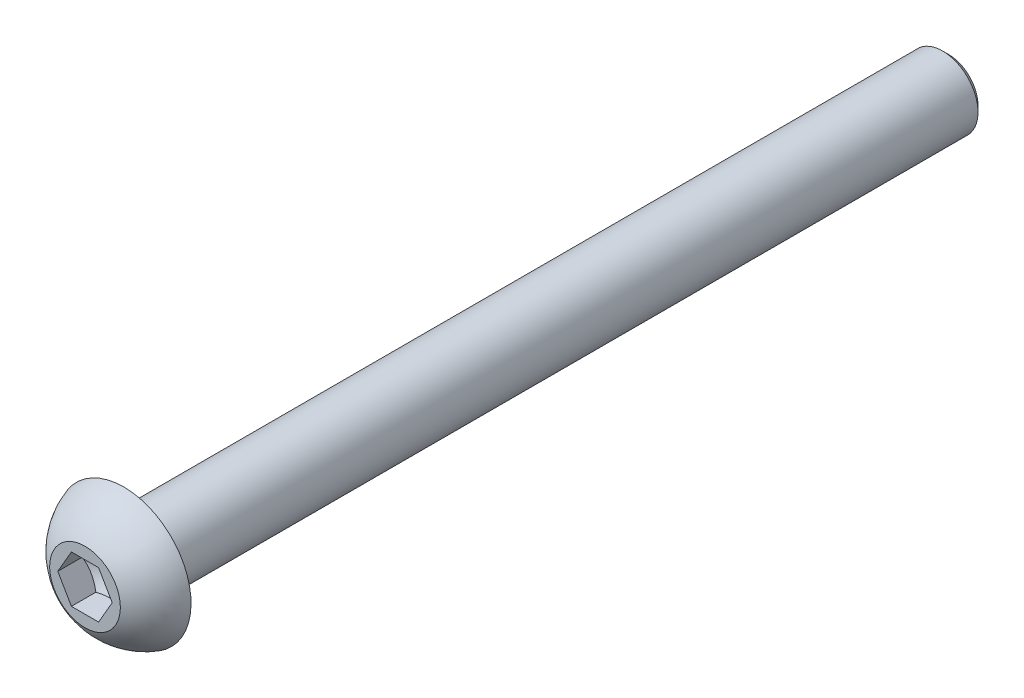
ISO-10303-21;
HEADER;
FILE_DESCRIPTION(('STEP AP214'),'2;1');
FILE_NAME('part.step','',(''),(''),'','','');
FILE_SCHEMA(('AUTOMOTIVE_DESIGN { 1 0 10303 214 1 1 1 1 }'));
ENDSEC;
DATA;
#1=APPLICATION_CONTEXT('core data for automotive mechanical design processes');
#2=APPLICATION_PROTOCOL_DEFINITION('international standard','automotive_design',2000,#1);
#3=PRODUCT_CONTEXT('',#1,'mechanical');
#4=PRODUCT('Part','Part','',(#3));
#5=PRODUCT_RELATED_PRODUCT_CATEGORY('part','',(#4));
#6=PRODUCT_DEFINITION_FORMATION('','',#4);
#7=PRODUCT_DEFINITION_CONTEXT('part definition',#1,'design');
#8=PRODUCT_DEFINITION('design','',#6,#7);
#9=PRODUCT_DEFINITION_SHAPE('','',#8);
#10=(LENGTH_UNIT() NAMED_UNIT(*) SI_UNIT(.MILLI.,.METRE.));
#11=(NAMED_UNIT(*) PLANE_ANGLE_UNIT() SI_UNIT($,.RADIAN.));
#12=(NAMED_UNIT(*) SI_UNIT($,.STERADIAN.) SOLID_ANGLE_UNIT());
#13=UNCERTAINTY_MEASURE_WITH_UNIT(LENGTH_MEASURE(1.E-05),#10,'distance_accuracy_value','');
#14=(GEOMETRIC_REPRESENTATION_CONTEXT(3) GLOBAL_UNCERTAINTY_ASSIGNED_CONTEXT((#13)) GLOBAL_UNIT_ASSIGNED_CONTEXT((#10,
#11,#12)) REPRESENTATION_CONTEXT('',''));
#15=CARTESIAN_POINT('',(0.,0.,0.));
#16=DIRECTION('',(0.,0.,1.));
#17=DIRECTION('',(1.,0.,0.));
#18=AXIS2_PLACEMENT_3D('',#15,#16,#17);
#19=CARTESIAN_POINT('',(0.,0.,-3.8646875));
#20=DIRECTION('',(0.,0.,1.));
#21=DIRECTION('',(0.,1.,0.));
#22=AXIS2_PLACEMENT_3D('',#19,#20,#21);
#23=CYLINDRICAL_SURFACE('',#22,1.5);
#24=CARTESIAN_POINT('',(0.,0.,-34.75));
#25=DIRECTION('',(0.,0.,-1.));
#26=DIRECTION('',(-1.,0.,0.));
#27=AXIS2_PLACEMENT_3D('',#24,#25,#26);
#28=CIRCLE('',#27,1.5);
#29=CARTESIAN_POINT('',(-1.5,0.,-34.75));
#30=VERTEX_POINT('',#29);
#31=EDGE_CURVE('E12',#30,#30,#28,.F.);
#32=ORIENTED_EDGE('',*,*,#31,.T.);
#33=EDGE_LOOP('',(#32));
#34=FACE_BOUND('',#33,.T.);
#35=CARTESIAN_POINT('',(0.,0.,0.));
#36=DIRECTION('',(0.,0.,-1.));
#37=DIRECTION('',(0.,1.,0.));
#38=AXIS2_PLACEMENT_3D('',#35,#36,#37);
#39=CIRCLE('',#38,1.5);
#40=CARTESIAN_POINT('',(0.,1.5,0.));
#41=VERTEX_POINT('',#40);
#42=EDGE_CURVE('E69',#41,#41,#39,.T.);
#43=ORIENTED_EDGE('',*,*,#42,.T.);
#44=EDGE_LOOP('',(#43));
#45=FACE_BOUND('',#44,.T.);
#46=ADVANCED_FACE('F53',(#34,#45),#23,.T.);
#47=CARTESIAN_POINT('',(0.,2.175,0.));
#48=DIRECTION('',(0.,0.,-1.));
#49=DIRECTION('',(0.,1.,0.));
#50=AXIS2_PLACEMENT_3D('',#47,#48,#49);
#51=PLANE('',#50);
#52=CARTESIAN_POINT('',(0.,0.,0.));
#53=DIRECTION('',(0.,0.,-1.));
#54=DIRECTION('',(0.,1.,0.));
#55=AXIS2_PLACEMENT_3D('',#52,#53,#54);
#56=CIRCLE('',#55,2.85);
#57=CARTESIAN_POINT('',(0.,2.85,0.));
#58=VERTEX_POINT('',#57);
#59=EDGE_CURVE('E172',#58,#58,#56,.T.);
#60=ORIENTED_EDGE('',*,*,#59,.T.);
#61=EDGE_LOOP('',(#60));
#62=FACE_BOUND('',#61,.T.);
#63=ORIENTED_EDGE('',*,*,#42,.F.);
#64=EDGE_LOOP('',(#63));
#65=FACE_BOUND('',#64,.T.);
#66=ADVANCED_FACE('F240',(#62,#65),#51,.T.);
#67=CARTESIAN_POINT('',(0.,0.,-0.848743432909574));
#68=DIRECTION('',(0.,0.,-1.));
#69=DIRECTION('',(-1.,0.,0.));
#70=AXIS2_PLACEMENT_3D('',#67,#68,#69);
#71=DEGENERATE_TOROIDAL_SURFACE('',#70,0.129313581999411,2.85,.T.);
#72=CARTESIAN_POINT('',(0.,0.,1.65));
#73=DIRECTION('',(0.,0.,-1.));
#74=DIRECTION('',(0.,1.,0.));
#75=AXIS2_PLACEMENT_3D('',#72,#73,#74);
#76=CIRCLE('',#75,1.5);
#77=CARTESIAN_POINT('',(0.,1.5,1.65));
#78=VERTEX_POINT('',#77);
#79=EDGE_CURVE('E166',#78,#78,#76,.T.);
#80=ORIENTED_EDGE('',*,*,#79,.T.);
#81=EDGE_LOOP('',(#80));
#82=FACE_BOUND('',#81,.T.);
#83=ORIENTED_EDGE('',*,*,#59,.F.);
#84=EDGE_LOOP('',(#83));
#85=FACE_BOUND('',#84,.T.);
#86=ADVANCED_FACE('F246',(#82,#85),#71,.T.);
#87=CARTESIAN_POINT('',(0.,0.75,1.65));
#88=DIRECTION('',(0.,0.,1.));
#89=DIRECTION('',(0.,-1.,0.));
#90=AXIS2_PLACEMENT_3D('',#87,#88,#89);
#91=PLANE('',#90);
#92=ORIENTED_EDGE('',*,*,#79,.F.);
#93=EDGE_LOOP('',(#92));
#94=FACE_BOUND('',#93,.T.);
#95=DIRECTION('',(-0.5,0.866025403784439,0.));
#96=VECTOR('',#95,1.);
#97=CARTESIAN_POINT('',(-1.02840476320958,-0.218749766874945,1.65));
#98=LINE('',#97,#96);
#99=CARTESIAN_POINT('',(-0.57735,-0.999999533749891,1.65));
#100=VERTEX_POINT('',#99);
#101=CARTESIAN_POINT('',(-1.1547,0.,1.65));
#102=VERTEX_POINT('',#101);
#103=EDGE_CURVE('E125',#100,#102,#98,.T.);
#104=ORIENTED_EDGE('',*,*,#103,.T.);
#105=DIRECTION('',(0.5,0.866025403784439,0.));
#106=VECTOR('',#105,1.);
#107=CARTESIAN_POINT('',(-0.703645236790418,0.781249766874945,1.65));
#108=LINE('',#107,#106);
#109=CARTESIAN_POINT('',(-0.57735,0.999999533749891,1.65));
#110=VERTEX_POINT('',#109);
#111=EDGE_CURVE('E100',#102,#110,#108,.T.);
#112=ORIENTED_EDGE('',*,*,#111,.T.);
#113=DIRECTION('',(1.,0.,0.));
#114=VECTOR('',#113,1.);
#115=CARTESIAN_POINT('',(0.,0.999999533749891,1.65));
#116=LINE('',#115,#114);
#117=CARTESIAN_POINT('',(0.57735,0.999999533749891,1.65));
#118=VERTEX_POINT('',#117);
#119=EDGE_CURVE('E154',#110,#118,#116,.T.);
#120=ORIENTED_EDGE('',*,*,#119,.T.);
#121=DIRECTION('',(0.5,-0.866025403784439,0.));
#122=VECTOR('',#121,1.);
#123=CARTESIAN_POINT('',(0.703645236790418,0.781249766874946,1.65));
#124=LINE('',#123,#122);
#125=CARTESIAN_POINT('',(1.1547,0.,1.65));
#126=VERTEX_POINT('',#125);
#127=EDGE_CURVE('E155',#118,#126,#124,.T.);
#128=ORIENTED_EDGE('',*,*,#127,.T.);
#129=DIRECTION('',(-0.5,-0.866025403784439,0.));
#130=VECTOR('',#129,1.);
#131=CARTESIAN_POINT('',(1.02840476320958,-0.218749766874946,1.65));
#132=LINE('',#131,#130);
#133=CARTESIAN_POINT('',(0.57735,-0.999999533749891,1.65));
#134=VERTEX_POINT('',#133);
#135=EDGE_CURVE('E183',#126,#134,#132,.T.);
#136=ORIENTED_EDGE('',*,*,#135,.T.);
#137=DIRECTION('',(-1.,0.,0.));
#138=VECTOR('',#137,1.);
#139=CARTESIAN_POINT('',(0.,-0.999999533749891,1.65));
#140=LINE('',#139,#138);
#141=EDGE_CURVE('E91',#134,#100,#140,.T.);
#142=ORIENTED_EDGE('',*,*,#141,.T.);
#143=EDGE_LOOP('',(#104,#112,#120,#128,#136,#142));
#144=FACE_BOUND('',#143,.T.);
#145=ADVANCED_FACE('F216',(#94,#144),#91,.T.);
#146=CARTESIAN_POINT('',(-0.866025,0.499999766874945,1.65));
#147=DIRECTION('',(-0.866025403784439,0.5,0.));
#148=DIRECTION('',(0.5,0.866025403784439,0.));
#149=AXIS2_PLACEMENT_3D('',#146,#147,#148);
#150=PLANE('',#149);
#151=CARTESIAN_POINT('',(-1.1547,0.,0.61));
#152=CARTESIAN_POINT('',(-0.866025,0.499999766874946,0.443333411041685));
#153=CARTESIAN_POINT('',(-0.57735,0.999999533749891,0.61));
#154=(BOUNDED_CURVE() B_SPLINE_CURVE(2,(#151,#152,#153),.UNSPECIFIED.,.F.,
.F.) B_SPLINE_CURVE_WITH_KNOTS((3,3),(0.,1.16843559329444),
.UNSPECIFIED.) CURVE() GEOMETRIC_REPRESENTATION_ITEM() RATIONAL_B_SPLINE_CURVE((1.,
1.15470053837925,1.)) REPRESENTATION_ITEM(''));
#155=CARTESIAN_POINT('',(-1.1547,0.,0.61));
#156=VERTEX_POINT('',#155);
#157=CARTESIAN_POINT('',(-0.57735,0.999999533749891,0.61));
#158=VERTEX_POINT('',#157);
#159=EDGE_CURVE('E121',#156,#158,#154,.T.);
#160=ORIENTED_EDGE('',*,*,#159,.T.);
#161=DIRECTION('',(0.,0.,-1.));
#162=VECTOR('',#161,1.);
#163=CARTESIAN_POINT('',(-0.57735,0.999999533749891,1.65));
#164=LINE('',#163,#162);
#165=EDGE_CURVE('E164',#110,#158,#164,.T.);
#166=ORIENTED_EDGE('',*,*,#165,.F.);
#167=ORIENTED_EDGE('',*,*,#111,.F.);
#168=DIRECTION('',(0.,0.,-1.));
#169=VECTOR('',#168,1.);
#170=CARTESIAN_POINT('',(-1.1547,0.,1.65));
#171=LINE('',#170,#169);
#172=EDGE_CURVE('E117',#102,#156,#171,.T.);
#173=ORIENTED_EDGE('',*,*,#172,.T.);
#174=EDGE_LOOP('',(#160,#166,#167,#173));
#175=FACE_BOUND('',#174,.T.);
#176=ADVANCED_FACE('F119',(#175),#150,.F.);
#177=CARTESIAN_POINT('',(0.,0.999999533749891,1.65));
#178=DIRECTION('',(0.,1.,0.));
#179=DIRECTION('',(1.,0.,0.));
#180=AXIS2_PLACEMENT_3D('',#177,#178,#179);
#181=PLANE('',#180);
#182=CARTESIAN_POINT('',(-0.57735,0.999999533749891,0.61));
#183=CARTESIAN_POINT('',(0.,0.999999533749893,0.443333411041685));
#184=CARTESIAN_POINT('',(0.57735,0.999999533749891,0.61));
#185=(BOUNDED_CURVE() B_SPLINE_CURVE(2,(#182,#183,#184),.UNSPECIFIED.,.F.,
.F.) B_SPLINE_CURVE_WITH_KNOTS((3,3),(0.,1.16843559329444),
.UNSPECIFIED.) CURVE() GEOMETRIC_REPRESENTATION_ITEM() RATIONAL_B_SPLINE_CURVE((1.,
1.15470053837925,1.)) REPRESENTATION_ITEM(''));
#186=CARTESIAN_POINT('',(0.57735,0.999999533749891,0.61));
#187=VERTEX_POINT('',#186);
#188=EDGE_CURVE('E139',#158,#187,#185,.T.);
#189=ORIENTED_EDGE('',*,*,#188,.T.);
#190=DIRECTION('',(0.,0.,-1.));
#191=VECTOR('',#190,1.);
#192=CARTESIAN_POINT('',(0.57735,0.999999533749891,1.65));
#193=LINE('',#192,#191);
#194=EDGE_CURVE('E149',#118,#187,#193,.T.);
#195=ORIENTED_EDGE('',*,*,#194,.F.);
#196=ORIENTED_EDGE('',*,*,#119,.F.);
#197=ORIENTED_EDGE('',*,*,#165,.T.);
#198=EDGE_LOOP('',(#189,#195,#196,#197));
#199=FACE_BOUND('',#198,.T.);
#200=ADVANCED_FACE('F219',(#199),#181,.F.);
#201=CARTESIAN_POINT('',(0.866025,0.499999766874946,1.65));
#202=DIRECTION('',(0.866025403784439,0.5,0.));
#203=DIRECTION('',(0.5,-0.866025403784439,0.));
#204=AXIS2_PLACEMENT_3D('',#201,#202,#203);
#205=PLANE('',#204);
#206=CARTESIAN_POINT('',(0.57735,0.999999533749891,0.61));
#207=CARTESIAN_POINT('',(0.866025,0.499999766874946,0.443333411041685));
#208=CARTESIAN_POINT('',(1.1547,0.,0.61));
#209=(BOUNDED_CURVE() B_SPLINE_CURVE(2,(#206,#207,#208),.UNSPECIFIED.,.F.,
.F.) B_SPLINE_CURVE_WITH_KNOTS((3,3),(0.,1.16843559329444),
.UNSPECIFIED.) CURVE() GEOMETRIC_REPRESENTATION_ITEM() RATIONAL_B_SPLINE_CURVE((1.,
1.15470053837925,1.)) REPRESENTATION_ITEM(''));
#210=CARTESIAN_POINT('',(1.1547,0.,0.61));
#211=VERTEX_POINT('',#210);
#212=EDGE_CURVE('E141',#187,#211,#209,.T.);
#213=ORIENTED_EDGE('',*,*,#212,.T.);
#214=DIRECTION('',(0.,0.,-1.));
#215=VECTOR('',#214,1.);
#216=CARTESIAN_POINT('',(1.1547,0.,1.65));
#217=LINE('',#216,#215);
#218=EDGE_CURVE('E147',#126,#211,#217,.T.);
#219=ORIENTED_EDGE('',*,*,#218,.F.);
#220=ORIENTED_EDGE('',*,*,#127,.F.);
#221=ORIENTED_EDGE('',*,*,#194,.T.);
#222=EDGE_LOOP('',(#213,#219,#220,#221));
#223=FACE_BOUND('',#222,.T.);
#224=ADVANCED_FACE('F203',(#223),#205,.F.);
#225=CARTESIAN_POINT('',(0.866025,-0.499999766874946,1.65));
#226=DIRECTION('',(0.866025403784439,-0.5,0.));
#227=DIRECTION('',(-0.5,-0.866025403784439,0.));
#228=AXIS2_PLACEMENT_3D('',#225,#226,#227);
#229=PLANE('',#228);
#230=CARTESIAN_POINT('',(1.1547,0.,0.61));
#231=CARTESIAN_POINT('',(0.866025,-0.499999766874945,0.443333411041685));
#232=CARTESIAN_POINT('',(0.57735,-0.999999533749891,0.61));
#233=(BOUNDED_CURVE() B_SPLINE_CURVE(2,(#230,#231,#232),.UNSPECIFIED.,.F.,
.F.) B_SPLINE_CURVE_WITH_KNOTS((3,3),(0.,1.16843559329444),
.UNSPECIFIED.) CURVE() GEOMETRIC_REPRESENTATION_ITEM() RATIONAL_B_SPLINE_CURVE((1.,
1.15470053837925,1.)) REPRESENTATION_ITEM(''));
#234=CARTESIAN_POINT('',(0.57735,-0.999999533749891,0.61));
#235=VERTEX_POINT('',#234);
#236=EDGE_CURVE('E126',#211,#235,#233,.T.);
#237=ORIENTED_EDGE('',*,*,#236,.T.);
#238=DIRECTION('',(0.,0.,-1.));
#239=VECTOR('',#238,1.);
#240=CARTESIAN_POINT('',(0.57735,-0.999999533749891,1.65));
#241=LINE('',#240,#239);
#242=EDGE_CURVE('E106',#134,#235,#241,.T.);
#243=ORIENTED_EDGE('',*,*,#242,.F.);
#244=ORIENTED_EDGE('',*,*,#135,.F.);
#245=ORIENTED_EDGE('',*,*,#218,.T.);
#246=EDGE_LOOP('',(#237,#243,#244,#245));
#247=FACE_BOUND('',#246,.T.);
#248=ADVANCED_FACE('F256',(#247),#229,.F.);
#249=CARTESIAN_POINT('',(0.,-0.999999533749891,1.65));
#250=DIRECTION('',(0.,-1.,0.));
#251=DIRECTION('',(-1.,0.,0.));
#252=AXIS2_PLACEMENT_3D('',#249,#250,#251);
#253=PLANE('',#252);
#254=CARTESIAN_POINT('',(0.57735,-0.999999533749891,0.61));
#255=CARTESIAN_POINT('',(0.,-0.999999533749893,0.443333411041685));
#256=CARTESIAN_POINT('',(-0.57735,-0.999999533749891,0.61));
#257=(BOUNDED_CURVE() B_SPLINE_CURVE(2,(#254,#255,#256),.UNSPECIFIED.,.F.,
.F.) B_SPLINE_CURVE_WITH_KNOTS((3,3),(0.,1.16843559329444),
.UNSPECIFIED.) CURVE() GEOMETRIC_REPRESENTATION_ITEM() RATIONAL_B_SPLINE_CURVE((1.,
1.15470053837925,1.)) REPRESENTATION_ITEM(''));
#258=CARTESIAN_POINT('',(-0.57735,-0.999999533749892,0.61));
#259=VERTEX_POINT('',#258);
#260=EDGE_CURVE('E134',#235,#259,#257,.T.);
#261=ORIENTED_EDGE('',*,*,#260,.T.);
#262=DIRECTION('',(0.,0.,-1.));
#263=VECTOR('',#262,1.);
#264=CARTESIAN_POINT('',(-0.57735,-0.999999533749891,1.65));
#265=LINE('',#264,#263);
#266=EDGE_CURVE('E131',#100,#259,#265,.T.);
#267=ORIENTED_EDGE('',*,*,#266,.F.);
#268=ORIENTED_EDGE('',*,*,#141,.F.);
#269=ORIENTED_EDGE('',*,*,#242,.T.);
#270=EDGE_LOOP('',(#261,#267,#268,#269));
#271=FACE_BOUND('',#270,.T.);
#272=ADVANCED_FACE('F195',(#271),#253,.F.);
#273=CARTESIAN_POINT('',(-0.866025,-0.499999766874946,1.65));
#274=DIRECTION('',(-0.866025403784439,-0.5,0.));
#275=DIRECTION('',(-0.5,0.866025403784439,0.));
#276=AXIS2_PLACEMENT_3D('',#273,#274,#275);
#277=PLANE('',#276);
#278=CARTESIAN_POINT('',(-0.57735,-0.999999533749891,0.61));
#279=CARTESIAN_POINT('',(-0.866025,-0.499999766874945,0.443333411041685));
#280=CARTESIAN_POINT('',(-1.1547,0.,0.61));
#281=(BOUNDED_CURVE() B_SPLINE_CURVE(2,(#278,#279,#280),.UNSPECIFIED.,.F.,
.F.) B_SPLINE_CURVE_WITH_KNOTS((3,3),(0.,1.16843559329444),
.UNSPECIFIED.) CURVE() GEOMETRIC_REPRESENTATION_ITEM() RATIONAL_B_SPLINE_CURVE((1.,
1.15470053837925,1.)) REPRESENTATION_ITEM(''));
#282=EDGE_CURVE('E129',#259,#156,#281,.T.);
#283=ORIENTED_EDGE('',*,*,#282,.T.);
#284=ORIENTED_EDGE('',*,*,#172,.F.);
#285=ORIENTED_EDGE('',*,*,#103,.F.);
#286=ORIENTED_EDGE('',*,*,#266,.T.);
#287=EDGE_LOOP('',(#283,#284,#285,#286));
#288=FACE_BOUND('',#287,.T.);
#289=ADVANCED_FACE('F130',(#288),#277,.F.);
#290=CARTESIAN_POINT('',(0.,0.,0.27666682208337));
#291=DIRECTION('',(0.,0.,1.));
#292=DIRECTION('',(0.,1.,0.));
#293=AXIS2_PLACEMENT_3D('',#290,#291,#292);
#294=CONICAL_SURFACE('',#293,0.57735,1.0471975511966);
#295=CARTESIAN_POINT('',(0.,0.,-0.056666355833261));
#296=VERTEX_POINT('',#295);
#297=VERTEX_LOOP('',#296);
#298=FACE_BOUND('',#297,.T.);
#299=ORIENTED_EDGE('',*,*,#212,.F.);
#300=ORIENTED_EDGE('',*,*,#188,.F.);
#301=ORIENTED_EDGE('',*,*,#159,.F.);
#302=ORIENTED_EDGE('',*,*,#282,.F.);
#303=ORIENTED_EDGE('',*,*,#260,.F.);
#304=ORIENTED_EDGE('',*,*,#236,.F.);
#305=EDGE_LOOP('',(#299,#300,#301,#302,#303,#304));
#306=FACE_BOUND('',#305,.T.);
#307=ADVANCED_FACE('F137',(#298,#306),#294,.F.);
#308=CARTESIAN_POINT('',(0.,2.175,-35.));
#309=DIRECTION('',(0.,0.,-1.));
#310=DIRECTION('',(0.,1.,0.));
#311=AXIS2_PLACEMENT_3D('',#308,#309,#310);
#312=PLANE('',#311);
#313=CARTESIAN_POINT('',(0.,0.,-35.));
#314=DIRECTION('',(0.,0.,-1.));
#315=DIRECTION('',(-1.,0.,0.));
#316=AXIS2_PLACEMENT_3D('',#313,#314,#315);
#317=CIRCLE('',#316,1.25);
#318=CARTESIAN_POINT('',(-1.25,0.,-35.));
#319=VERTEX_POINT('',#318);
#320=EDGE_CURVE('E63',#319,#319,#317,.T.);
#321=ORIENTED_EDGE('',*,*,#320,.T.);
#322=EDGE_LOOP('',(#321));
#323=FACE_BOUND('',#322,.T.);
#324=ADVANCED_FACE('F226',(#323),#312,.T.);
#325=CARTESIAN_POINT('',(0.,0.,-35.));
#326=DIRECTION('',(0.,0.,1.));
#327=DIRECTION('',(1.,0.,0.));
#328=AXIS2_PLACEMENT_3D('',#325,#326,#327);
#329=CONICAL_SURFACE('',#328,1.25,0.785398163397439);
#330=ORIENTED_EDGE('',*,*,#31,.F.);
#331=EDGE_LOOP('',(#330));
#332=FACE_BOUND('',#331,.T.);
#333=ORIENTED_EDGE('',*,*,#320,.F.);
#334=EDGE_LOOP('',(#333));
#335=FACE_BOUND('',#334,.T.);
#336=ADVANCED_FACE('F56',(#332,#335),#329,.T.);
#337=CLOSED_SHELL('',(#46,#66,#86,#145,#176,#200,#224,#248,#272,#289,#307,#324,#336));
#338=MANIFOLD_SOLID_BREP('B2',#337);
#339=ADVANCED_BREP_SHAPE_REPRESENTATION('',(#18,#338),#14);
#340=SHAPE_DEFINITION_REPRESENTATION(#9,#339);
ENDSEC;
END-ISO-10303-21;
